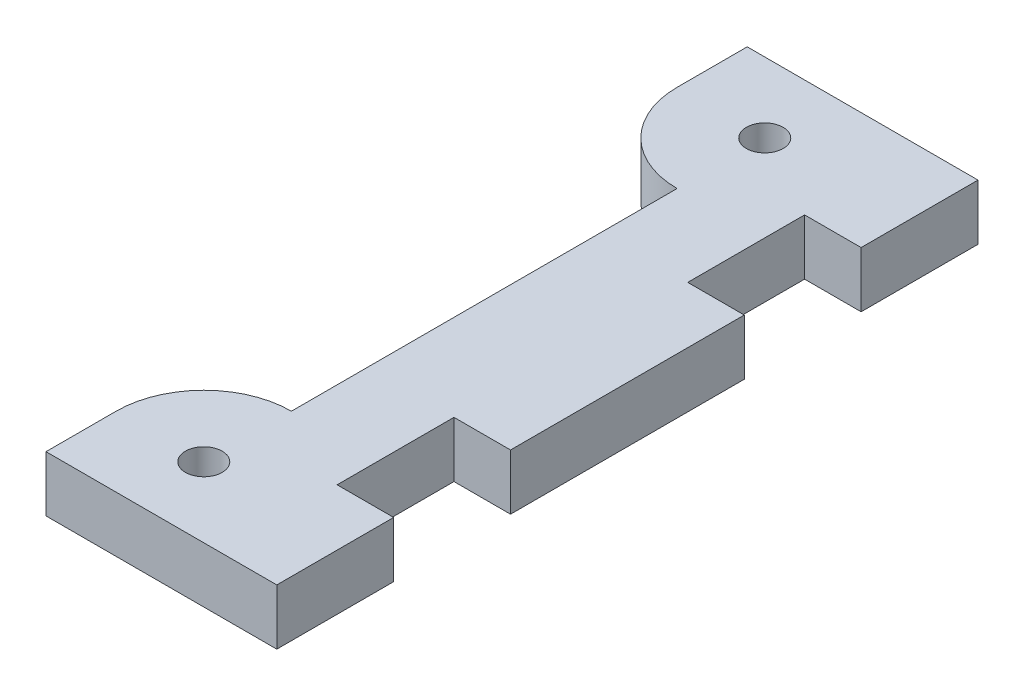
ISO-10303-21;
HEADER;
FILE_DESCRIPTION(('STEP AP214'),'2;1');
FILE_NAME('part.step','',(''),(''),'','','');
FILE_SCHEMA(('AUTOMOTIVE_DESIGN { 1 0 10303 214 1 1 1 1 }'));
ENDSEC;
DATA;
#1=APPLICATION_CONTEXT('core data for automotive mechanical design processes');
#2=APPLICATION_PROTOCOL_DEFINITION('international standard','automotive_design',2000,#1);
#3=PRODUCT_CONTEXT('',#1,'mechanical');
#4=PRODUCT('Part','Part','',(#3));
#5=PRODUCT_RELATED_PRODUCT_CATEGORY('part','',(#4));
#6=PRODUCT_DEFINITION_FORMATION('','',#4);
#7=PRODUCT_DEFINITION_CONTEXT('part definition',#1,'design');
#8=PRODUCT_DEFINITION('design','',#6,#7);
#9=PRODUCT_DEFINITION_SHAPE('','',#8);
#10=(LENGTH_UNIT() NAMED_UNIT(*) SI_UNIT(.MILLI.,.METRE.));
#11=(NAMED_UNIT(*) PLANE_ANGLE_UNIT() SI_UNIT($,.RADIAN.));
#12=(NAMED_UNIT(*) SI_UNIT($,.STERADIAN.) SOLID_ANGLE_UNIT());
#13=UNCERTAINTY_MEASURE_WITH_UNIT(LENGTH_MEASURE(1.E-05),#10,'distance_accuracy_value','');
#14=(GEOMETRIC_REPRESENTATION_CONTEXT(3) GLOBAL_UNCERTAINTY_ASSIGNED_CONTEXT((#13)) GLOBAL_UNIT_ASSIGNED_CONTEXT((#10,
#11,#12)) REPRESENTATION_CONTEXT('',''));
#15=CARTESIAN_POINT('',(0.,0.,0.));
#16=DIRECTION('',(0.,0.,1.));
#17=DIRECTION('',(1.,0.,0.));
#18=AXIS2_PLACEMENT_3D('',#15,#16,#17);
#19=CARTESIAN_POINT('',(44.165,6.35,40.));
#20=DIRECTION('',(-1.,0.,0.));
#21=DIRECTION('',(0.,0.,1.));
#22=AXIS2_PLACEMENT_3D('',#19,#20,#21);
#23=PLANE('',#22);
#24=DIRECTION('',(0.,0.,-1.));
#25=VECTOR('',#24,1.);
#26=CARTESIAN_POINT('',(44.165,0.,40.));
#27=LINE('',#26,#25);
#28=CARTESIAN_POINT('',(44.165,0.,40.));
#29=VERTEX_POINT('',#28);
#30=CARTESIAN_POINT('',(44.165,0.,26.6666666666667));
#31=VERTEX_POINT('',#30);
#32=EDGE_CURVE('E274',#29,#31,#27,.T.);
#33=ORIENTED_EDGE('',*,*,#32,.T.);
#34=DIRECTION('',(0.,1.,0.));
#35=VECTOR('',#34,1.);
#36=CARTESIAN_POINT('',(44.165,0.,26.6666666666667));
#37=LINE('',#36,#35);
#38=CARTESIAN_POINT('',(44.165,6.35,26.6666666666667));
#39=VERTEX_POINT('',#38);
#40=EDGE_CURVE('E232',#31,#39,#37,.T.);
#41=ORIENTED_EDGE('',*,*,#40,.T.);
#42=DIRECTION('',(0.,0.,-1.));
#43=VECTOR('',#42,1.);
#44=CARTESIAN_POINT('',(44.165,6.35,40.));
#45=LINE('',#44,#43);
#46=CARTESIAN_POINT('',(44.165,6.35,40.));
#47=VERTEX_POINT('',#46);
#48=EDGE_CURVE('E265',#47,#39,#45,.T.);
#49=ORIENTED_EDGE('',*,*,#48,.F.);
#50=DIRECTION('',(0.,-1.,0.));
#51=VECTOR('',#50,1.);
#52=CARTESIAN_POINT('',(44.165,6.35,40.));
#53=LINE('',#52,#51);
#54=EDGE_CURVE('E273',#47,#29,#53,.T.);
#55=ORIENTED_EDGE('',*,*,#54,.T.);
#56=EDGE_LOOP('',(#33,#41,#49,#55));
#57=FACE_BOUND('',#56,.T.);
#58=ADVANCED_FACE('F51',(#57),#23,.F.);
#59=CARTESIAN_POINT('',(44.165,6.35,13.3333333333333));
#60=VERTEX_POINT('',#59);
#61=CARTESIAN_POINT('',(44.165,6.35,-13.3333333333333));
#62=VERTEX_POINT('',#61);
#63=EDGE_CURVE('E268',#60,#62,#45,.T.);
#64=ORIENTED_EDGE('',*,*,#63,.F.);
#65=DIRECTION('',(0.,1.,0.));
#66=VECTOR('',#65,1.);
#67=CARTESIAN_POINT('',(44.165,0.,13.3333333333333));
#68=LINE('',#67,#66);
#69=CARTESIAN_POINT('',(44.165,0.,13.3333333333333));
#70=VERTEX_POINT('',#69);
#71=EDGE_CURVE('E223',#70,#60,#68,.T.);
#72=ORIENTED_EDGE('',*,*,#71,.F.);
#73=CARTESIAN_POINT('',(44.165,0.,-13.3333333333333));
#74=VERTEX_POINT('',#73);
#75=EDGE_CURVE('E278',#70,#74,#27,.T.);
#76=ORIENTED_EDGE('',*,*,#75,.T.);
#77=DIRECTION('',(0.,1.,0.));
#78=VECTOR('',#77,1.);
#79=CARTESIAN_POINT('',(44.165,0.,-13.3333333333333));
#80=LINE('',#79,#78);
#81=EDGE_CURVE('E214',#74,#62,#80,.T.);
#82=ORIENTED_EDGE('',*,*,#81,.T.);
#83=EDGE_LOOP('',(#64,#72,#76,#82));
#84=FACE_BOUND('',#83,.T.);
#85=ADVANCED_FACE('F325',(#84),#23,.F.);
#86=CARTESIAN_POINT('',(44.165,6.35,-26.6666666666667));
#87=VERTEX_POINT('',#86);
#88=CARTESIAN_POINT('',(44.165,6.35,-40.));
#89=VERTEX_POINT('',#88);
#90=EDGE_CURVE('E269',#87,#89,#45,.T.);
#91=ORIENTED_EDGE('',*,*,#90,.F.);
#92=DIRECTION('',(0.,1.,0.));
#93=VECTOR('',#92,1.);
#94=CARTESIAN_POINT('',(44.165,0.,-26.6666666666667));
#95=LINE('',#94,#93);
#96=CARTESIAN_POINT('',(44.165,0.,-26.6666666666667));
#97=VERTEX_POINT('',#96);
#98=EDGE_CURVE('E241',#97,#87,#95,.T.);
#99=ORIENTED_EDGE('',*,*,#98,.F.);
#100=CARTESIAN_POINT('',(44.165,0.,-40.));
#101=VERTEX_POINT('',#100);
#102=EDGE_CURVE('E235',#97,#101,#27,.T.);
#103=ORIENTED_EDGE('',*,*,#102,.T.);
#104=DIRECTION('',(0.,-1.,0.));
#105=VECTOR('',#104,1.);
#106=CARTESIAN_POINT('',(44.165,6.35,-40.));
#107=LINE('',#106,#105);
#108=EDGE_CURVE('E285',#89,#101,#107,.T.);
#109=ORIENTED_EDGE('',*,*,#108,.F.);
#110=EDGE_LOOP('',(#91,#99,#103,#109));
#111=FACE_BOUND('',#110,.T.);
#112=ADVANCED_FACE('F53',(#111),#23,.F.);
#113=CARTESIAN_POINT('',(-44.165,6.35,-40.));
#114=DIRECTION('',(0.,0.,1.));
#115=DIRECTION('',(1.,0.,0.));
#116=AXIS2_PLACEMENT_3D('',#113,#114,#115);
#117=PLANE('',#116);
#118=DIRECTION('',(-1.,0.,0.));
#119=VECTOR('',#118,1.);
#120=CARTESIAN_POINT('',(-44.165,0.,-40.));
#121=LINE('',#120,#119);
#122=CARTESIAN_POINT('',(17.8350000000002,0.,-40.));
#123=VERTEX_POINT('',#122);
#124=EDGE_CURVE('E277',#101,#123,#121,.T.);
#125=ORIENTED_EDGE('',*,*,#124,.T.);
#126=DIRECTION('',(0.,-1.,0.));
#127=VECTOR('',#126,1.);
#128=CARTESIAN_POINT('',(17.8350000000002,-0.00100000000000013,-40.));
#129=LINE('',#128,#127);
#130=CARTESIAN_POINT('',(17.8350000000002,6.35,-40.));
#131=VERTEX_POINT('',#130);
#132=EDGE_CURVE('E336',#131,#123,#129,.T.);
#133=ORIENTED_EDGE('',*,*,#132,.F.);
#134=DIRECTION('',(-1.,0.,0.));
#135=VECTOR('',#134,1.);
#136=CARTESIAN_POINT('',(-44.165,6.35,-40.));
#137=LINE('',#136,#135);
#138=EDGE_CURVE('E185',#89,#131,#137,.T.);
#139=ORIENTED_EDGE('',*,*,#138,.F.);
#140=ORIENTED_EDGE('',*,*,#108,.T.);
#141=EDGE_LOOP('',(#125,#133,#139,#140));
#142=FACE_BOUND('',#141,.T.);
#143=ADVANCED_FACE('F335',(#142),#117,.F.);
#144=CARTESIAN_POINT('',(-44.165,6.35,40.));
#145=DIRECTION('',(0.,0.,-1.));
#146=DIRECTION('',(-1.,0.,0.));
#147=AXIS2_PLACEMENT_3D('',#144,#145,#146);
#148=PLANE('',#147);
#149=DIRECTION('',(1.,0.,0.));
#150=VECTOR('',#149,1.);
#151=CARTESIAN_POINT('',(-44.165,6.35,40.));
#152=LINE('',#151,#150);
#153=CARTESIAN_POINT('',(17.8349999999997,6.35,40.));
#154=VERTEX_POINT('',#153);
#155=EDGE_CURVE('E271',#154,#47,#152,.T.);
#156=ORIENTED_EDGE('',*,*,#155,.F.);
#157=DIRECTION('',(0.,1.,0.));
#158=VECTOR('',#157,1.);
#159=CARTESIAN_POINT('',(17.8349999999997,-0.00100000000000013,40.));
#160=LINE('',#159,#158);
#161=CARTESIAN_POINT('',(17.8349999999997,0.,40.));
#162=VERTEX_POINT('',#161);
#163=EDGE_CURVE('E307',#162,#154,#160,.T.);
#164=ORIENTED_EDGE('',*,*,#163,.F.);
#165=DIRECTION('',(1.,0.,0.));
#166=VECTOR('',#165,1.);
#167=CARTESIAN_POINT('',(-44.165,0.,40.));
#168=LINE('',#167,#166);
#169=EDGE_CURVE('E281',#162,#29,#168,.T.);
#170=ORIENTED_EDGE('',*,*,#169,.T.);
#171=ORIENTED_EDGE('',*,*,#54,.F.);
#172=EDGE_LOOP('',(#156,#164,#170,#171));
#173=FACE_BOUND('',#172,.T.);
#174=ADVANCED_FACE('F306',(#173),#148,.F.);
#175=CARTESIAN_POINT('',(0.,6.35,0.));
#176=DIRECTION('',(0.,-1.,0.));
#177=DIRECTION('',(0.,0.,-1.));
#178=AXIS2_PLACEMENT_3D('',#175,#176,#177);
#179=PLANE('',#178);
#180=ORIENTED_EDGE('',*,*,#138,.T.);
#181=DIRECTION('',(0.,0.,-1.));
#182=VECTOR('',#181,1.);
#183=CARTESIAN_POINT('',(17.8350000000002,6.35,-45.));
#184=LINE('',#183,#182);
#185=CARTESIAN_POINT('',(17.8350000000002,6.35,-31.9999999999998));
#186=VERTEX_POINT('',#185);
#187=EDGE_CURVE('E168',#186,#131,#184,.T.);
#188=ORIENTED_EDGE('',*,*,#187,.F.);
#189=CARTESIAN_POINT('',(27.8350000000002,6.35,-31.9999999999998));
#190=DIRECTION('',(0.,-1.,0.));
#191=DIRECTION('',(0.,0.,1.));
#192=AXIS2_PLACEMENT_3D('',#189,#190,#191);
#193=CIRCLE('',#192,10.);
#194=CARTESIAN_POINT('',(27.8350000000002,6.35,-21.9999999999998));
#195=VERTEX_POINT('',#194);
#196=EDGE_CURVE('E175',#195,#186,#193,.T.);
#197=ORIENTED_EDGE('',*,*,#196,.F.);
#198=DIRECTION('',(0.,0.,-1.));
#199=VECTOR('',#198,1.);
#200=CARTESIAN_POINT('',(27.8349999999999,6.35,10.0000000000003));
#201=LINE('',#200,#199);
#202=CARTESIAN_POINT('',(27.8349999999998,6.35,22.0000000000003));
#203=VERTEX_POINT('',#202);
#204=EDGE_CURVE('E201',#203,#195,#201,.T.);
#205=ORIENTED_EDGE('',*,*,#204,.F.);
#206=CARTESIAN_POINT('',(27.8349999999997,6.35,32.0000000000003));
#207=DIRECTION('',(0.,-1.,0.));
#208=DIRECTION('',(0.,0.,1.));
#209=AXIS2_PLACEMENT_3D('',#206,#207,#208);
#210=CIRCLE('',#209,10.);
#211=CARTESIAN_POINT('',(17.8349999999997,6.35,32.0000000000002));
#212=VERTEX_POINT('',#211);
#213=EDGE_CURVE('E66',#212,#203,#210,.T.);
#214=ORIENTED_EDGE('',*,*,#213,.F.);
#215=DIRECTION('',(0.,0.,-1.));
#216=VECTOR('',#215,1.);
#217=CARTESIAN_POINT('',(17.8349999999997,6.35,32.0000000000002));
#218=LINE('',#217,#216);
#219=EDGE_CURVE('E187',#154,#212,#218,.T.);
#220=ORIENTED_EDGE('',*,*,#219,.F.);
#221=ORIENTED_EDGE('',*,*,#155,.T.);
#222=ORIENTED_EDGE('',*,*,#48,.T.);
#223=DIRECTION('',(1.,0.,0.));
#224=VECTOR('',#223,1.);
#225=CARTESIAN_POINT('',(44.165,6.35,26.6666666666667));
#226=LINE('',#225,#224);
#227=CARTESIAN_POINT('',(37.715,6.35,26.6666666666667));
#228=VERTEX_POINT('',#227);
#229=EDGE_CURVE('E218',#228,#39,#226,.T.);
#230=ORIENTED_EDGE('',*,*,#229,.F.);
#231=DIRECTION('',(0.,0.,1.));
#232=VECTOR('',#231,1.);
#233=CARTESIAN_POINT('',(37.715,6.35,26.6666666666667));
#234=LINE('',#233,#232);
#235=CARTESIAN_POINT('',(37.715,6.35,13.3333333333333));
#236=VERTEX_POINT('',#235);
#237=EDGE_CURVE('E227',#236,#228,#234,.T.);
#238=ORIENTED_EDGE('',*,*,#237,.F.);
#239=DIRECTION('',(-1.,0.,0.));
#240=VECTOR('',#239,1.);
#241=CARTESIAN_POINT('',(37.715,6.35,13.3333333333333));
#242=LINE('',#241,#240);
#243=EDGE_CURVE('E224',#60,#236,#242,.T.);
#244=ORIENTED_EDGE('',*,*,#243,.F.);
#245=ORIENTED_EDGE('',*,*,#63,.T.);
#246=DIRECTION('',(1.,0.,0.));
#247=VECTOR('',#246,1.);
#248=CARTESIAN_POINT('',(37.715,6.35,-13.3333333333333));
#249=LINE('',#248,#247);
#250=CARTESIAN_POINT('',(37.715,6.35,-13.3333333333333));
#251=VERTEX_POINT('',#250);
#252=EDGE_CURVE('E250',#251,#62,#249,.T.);
#253=ORIENTED_EDGE('',*,*,#252,.F.);
#254=DIRECTION('',(0.,0.,1.));
#255=VECTOR('',#254,1.);
#256=CARTESIAN_POINT('',(37.715,6.35,-26.6666666666667));
#257=LINE('',#256,#255);
#258=CARTESIAN_POINT('',(37.715,6.35,-26.6666666666667));
#259=VERTEX_POINT('',#258);
#260=EDGE_CURVE('E252',#259,#251,#257,.T.);
#261=ORIENTED_EDGE('',*,*,#260,.F.);
#262=DIRECTION('',(-1.,0.,0.));
#263=VECTOR('',#262,1.);
#264=CARTESIAN_POINT('',(44.165,6.35,-26.6666666666667));
#265=LINE('',#264,#263);
#266=EDGE_CURVE('E228',#87,#259,#265,.T.);
#267=ORIENTED_EDGE('',*,*,#266,.F.);
#268=ORIENTED_EDGE('',*,*,#90,.T.);
#269=EDGE_LOOP('',(#180,#188,#197,#205,#214,#220,#221,#222,#230,#238,#244,#245,#253,#261,#267,#268));
#270=FACE_BOUND('',#269,.T.);
#271=CARTESIAN_POINT('',(27.835,6.35,-32.));
#272=DIRECTION('',(0.,1.,0.));
#273=DIRECTION('',(0.,0.,1.));
#274=AXIS2_PLACEMENT_3D('',#271,#272,#273);
#275=CIRCLE('',#274,2.09999999999998);
#276=CARTESIAN_POINT('',(27.835,6.35,-29.9));
#277=VERTEX_POINT('',#276);
#278=EDGE_CURVE('E192',#277,#277,#275,.T.);
#279=ORIENTED_EDGE('',*,*,#278,.F.);
#280=EDGE_LOOP('',(#279));
#281=FACE_BOUND('',#280,.T.);
#282=CARTESIAN_POINT('',(27.835,6.35,32.));
#283=DIRECTION('',(0.,1.,0.));
#284=DIRECTION('',(0.,0.,1.));
#285=AXIS2_PLACEMENT_3D('',#282,#283,#284);
#286=CIRCLE('',#285,2.09999999999998);
#287=CARTESIAN_POINT('',(27.835,6.35,34.1));
#288=VERTEX_POINT('',#287);
#289=EDGE_CURVE('E208',#288,#288,#286,.T.);
#290=ORIENTED_EDGE('',*,*,#289,.F.);
#291=EDGE_LOOP('',(#290));
#292=FACE_BOUND('',#291,.T.);
#293=ADVANCED_FACE('F181',(#270,#281,#292),#179,.F.);
#294=CARTESIAN_POINT('',(0.,0.,0.));
#295=DIRECTION('',(0.,-1.,0.));
#296=DIRECTION('',(0.,0.,-1.));
#297=AXIS2_PLACEMENT_3D('',#294,#295,#296);
#298=PLANE('',#297);
#299=DIRECTION('',(0.,0.,-1.));
#300=VECTOR('',#299,1.);
#301=CARTESIAN_POINT('',(17.8350000000002,0.,-45.));
#302=LINE('',#301,#300);
#303=CARTESIAN_POINT('',(17.8350000000002,0.,-31.9999999999998));
#304=VERTEX_POINT('',#303);
#305=EDGE_CURVE('E171',#304,#123,#302,.T.);
#306=ORIENTED_EDGE('',*,*,#305,.T.);
#307=ORIENTED_EDGE('',*,*,#124,.F.);
#308=ORIENTED_EDGE('',*,*,#102,.F.);
#309=DIRECTION('',(-1.,0.,0.));
#310=VECTOR('',#309,1.);
#311=CARTESIAN_POINT('',(44.165,0.,-26.6666666666667));
#312=LINE('',#311,#310);
#313=CARTESIAN_POINT('',(37.715,0.,-26.6666666666667));
#314=VERTEX_POINT('',#313);
#315=EDGE_CURVE('E253',#97,#314,#312,.T.);
#316=ORIENTED_EDGE('',*,*,#315,.T.);
#317=DIRECTION('',(0.,0.,1.));
#318=VECTOR('',#317,1.);
#319=CARTESIAN_POINT('',(37.715,0.,-26.6666666666667));
#320=LINE('',#319,#318);
#321=CARTESIAN_POINT('',(37.715,0.,-13.3333333333333));
#322=VERTEX_POINT('',#321);
#323=EDGE_CURVE('E260',#314,#322,#320,.T.);
#324=ORIENTED_EDGE('',*,*,#323,.T.);
#325=DIRECTION('',(1.,0.,0.));
#326=VECTOR('',#325,1.);
#327=CARTESIAN_POINT('',(37.715,0.,-13.3333333333333));
#328=LINE('',#327,#326);
#329=EDGE_CURVE('E243',#322,#74,#328,.T.);
#330=ORIENTED_EDGE('',*,*,#329,.T.);
#331=ORIENTED_EDGE('',*,*,#75,.F.);
#332=DIRECTION('',(-1.,0.,0.));
#333=VECTOR('',#332,1.);
#334=CARTESIAN_POINT('',(37.715,0.,13.3333333333333));
#335=LINE('',#334,#333);
#336=CARTESIAN_POINT('',(37.715,0.,13.3333333333333));
#337=VERTEX_POINT('',#336);
#338=EDGE_CURVE('E215',#70,#337,#335,.T.);
#339=ORIENTED_EDGE('',*,*,#338,.T.);
#340=DIRECTION('',(0.,0.,1.));
#341=VECTOR('',#340,1.);
#342=CARTESIAN_POINT('',(37.715,0.,26.6666666666667));
#343=LINE('',#342,#341);
#344=CARTESIAN_POINT('',(37.715,0.,26.6666666666667));
#345=VERTEX_POINT('',#344);
#346=EDGE_CURVE('E74',#337,#345,#343,.T.);
#347=ORIENTED_EDGE('',*,*,#346,.T.);
#348=DIRECTION('',(1.,0.,0.));
#349=VECTOR('',#348,1.);
#350=CARTESIAN_POINT('',(44.165,0.,26.6666666666667));
#351=LINE('',#350,#349);
#352=EDGE_CURVE('E220',#345,#31,#351,.T.);
#353=ORIENTED_EDGE('',*,*,#352,.T.);
#354=ORIENTED_EDGE('',*,*,#32,.F.);
#355=ORIENTED_EDGE('',*,*,#169,.F.);
#356=DIRECTION('',(0.,0.,-1.));
#357=VECTOR('',#356,1.);
#358=CARTESIAN_POINT('',(17.8349999999997,0.,32.0000000000002));
#359=LINE('',#358,#357);
#360=CARTESIAN_POINT('',(17.8349999999997,0.,32.0000000000002));
#361=VERTEX_POINT('',#360);
#362=EDGE_CURVE('E186',#162,#361,#359,.T.);
#363=ORIENTED_EDGE('',*,*,#362,.T.);
#364=CARTESIAN_POINT('',(27.8349999999997,0.,32.0000000000003));
#365=DIRECTION('',(0.,-1.,0.));
#366=DIRECTION('',(0.,0.,-1.));
#367=AXIS2_PLACEMENT_3D('',#364,#365,#366);
#368=CIRCLE('',#367,10.);
#369=CARTESIAN_POINT('',(27.8349999999998,0.,22.0000000000003));
#370=VERTEX_POINT('',#369);
#371=EDGE_CURVE('E11',#370,#361,#368,.F.);
#372=ORIENTED_EDGE('',*,*,#371,.F.);
#373=DIRECTION('',(0.,0.,1.));
#374=VECTOR('',#373,1.);
#375=CARTESIAN_POINT('',(27.835,0.,1.77048769163986E-13));
#376=LINE('',#375,#374);
#377=CARTESIAN_POINT('',(27.8350000000002,0.,-21.9999999999998));
#378=VERTEX_POINT('',#377);
#379=EDGE_CURVE('E288',#378,#370,#376,.T.);
#380=ORIENTED_EDGE('',*,*,#379,.F.);
#381=CARTESIAN_POINT('',(27.8350000000002,0.,-31.9999999999998));
#382=DIRECTION('',(0.,-1.,0.));
#383=DIRECTION('',(0.,0.,-1.));
#384=AXIS2_PLACEMENT_3D('',#381,#382,#383);
#385=CIRCLE('',#384,10.);
#386=EDGE_CURVE('E59',#304,#378,#385,.F.);
#387=ORIENTED_EDGE('',*,*,#386,.F.);
#388=EDGE_LOOP('',(#306,#307,#308,#316,#324,#330,#331,#339,#347,#353,#354,#355,#363,#372,#380,#387));
#389=FACE_BOUND('',#388,.T.);
#390=CARTESIAN_POINT('',(27.835,0.,-32.));
#391=DIRECTION('',(0.,1.,0.));
#392=DIRECTION('',(0.,0.,1.));
#393=AXIS2_PLACEMENT_3D('',#390,#391,#392);
#394=CIRCLE('',#393,2.09999999999998);
#395=CARTESIAN_POINT('',(27.835,0.,-29.9));
#396=VERTEX_POINT('',#395);
#397=EDGE_CURVE('E195',#396,#396,#394,.T.);
#398=ORIENTED_EDGE('',*,*,#397,.T.);
#399=EDGE_LOOP('',(#398));
#400=FACE_BOUND('',#399,.T.);
#401=CARTESIAN_POINT('',(27.835,0.,32.));
#402=DIRECTION('',(0.,1.,0.));
#403=DIRECTION('',(0.,0.,1.));
#404=AXIS2_PLACEMENT_3D('',#401,#402,#403);
#405=CIRCLE('',#404,2.09999999999998);
#406=CARTESIAN_POINT('',(27.835,0.,34.1));
#407=VERTEX_POINT('',#406);
#408=EDGE_CURVE('E211',#407,#407,#405,.T.);
#409=ORIENTED_EDGE('',*,*,#408,.T.);
#410=EDGE_LOOP('',(#409));
#411=FACE_BOUND('',#410,.T.);
#412=ADVANCED_FACE('F294',(#389,#400,#411),#298,.T.);
#413=CARTESIAN_POINT('',(37.715,0.,-13.3333333333333));
#414=DIRECTION('',(0.,0.,1.));
#415=DIRECTION('',(1.,0.,0.));
#416=AXIS2_PLACEMENT_3D('',#413,#414,#415);
#417=PLANE('',#416);
#418=ORIENTED_EDGE('',*,*,#252,.T.);
#419=ORIENTED_EDGE('',*,*,#81,.F.);
#420=ORIENTED_EDGE('',*,*,#329,.F.);
#421=DIRECTION('',(0.,1.,0.));
#422=VECTOR('',#421,1.);
#423=CARTESIAN_POINT('',(37.715,0.,-13.3333333333333));
#424=LINE('',#423,#422);
#425=EDGE_CURVE('E246',#322,#251,#424,.T.);
#426=ORIENTED_EDGE('',*,*,#425,.T.);
#427=EDGE_LOOP('',(#418,#419,#420,#426));
#428=FACE_BOUND('',#427,.T.);
#429=ADVANCED_FACE('F370',(#428),#417,.F.);
#430=CARTESIAN_POINT('',(37.715,0.,-26.6666666666667));
#431=DIRECTION('',(-1.,0.,0.));
#432=DIRECTION('',(0.,0.,1.));
#433=AXIS2_PLACEMENT_3D('',#430,#431,#432);
#434=PLANE('',#433);
#435=ORIENTED_EDGE('',*,*,#260,.T.);
#436=ORIENTED_EDGE('',*,*,#425,.F.);
#437=ORIENTED_EDGE('',*,*,#323,.F.);
#438=DIRECTION('',(0.,1.,0.));
#439=VECTOR('',#438,1.);
#440=CARTESIAN_POINT('',(37.715,0.,-26.6666666666667));
#441=LINE('',#440,#439);
#442=EDGE_CURVE('E244',#314,#259,#441,.T.);
#443=ORIENTED_EDGE('',*,*,#442,.T.);
#444=EDGE_LOOP('',(#435,#436,#437,#443));
#445=FACE_BOUND('',#444,.T.);
#446=ADVANCED_FACE('F374',(#445),#434,.F.);
#447=CARTESIAN_POINT('',(44.165,0.,-26.6666666666667));
#448=DIRECTION('',(0.,0.,-1.));
#449=DIRECTION('',(-1.,0.,0.));
#450=AXIS2_PLACEMENT_3D('',#447,#448,#449);
#451=PLANE('',#450);
#452=ORIENTED_EDGE('',*,*,#266,.T.);
#453=ORIENTED_EDGE('',*,*,#442,.F.);
#454=ORIENTED_EDGE('',*,*,#315,.F.);
#455=ORIENTED_EDGE('',*,*,#98,.T.);
#456=EDGE_LOOP('',(#452,#453,#454,#455));
#457=FACE_BOUND('',#456,.T.);
#458=ADVANCED_FACE('F378',(#457),#451,.F.);
#459=CARTESIAN_POINT('',(44.165,0.,26.6666666666667));
#460=DIRECTION('',(0.,0.,1.));
#461=DIRECTION('',(1.,0.,0.));
#462=AXIS2_PLACEMENT_3D('',#459,#460,#461);
#463=PLANE('',#462);
#464=ORIENTED_EDGE('',*,*,#229,.T.);
#465=ORIENTED_EDGE('',*,*,#40,.F.);
#466=ORIENTED_EDGE('',*,*,#352,.F.);
#467=DIRECTION('',(0.,1.,0.));
#468=VECTOR('',#467,1.);
#469=CARTESIAN_POINT('',(37.715,0.,26.6666666666667));
#470=LINE('',#469,#468);
#471=EDGE_CURVE('E236',#345,#228,#470,.T.);
#472=ORIENTED_EDGE('',*,*,#471,.T.);
#473=EDGE_LOOP('',(#464,#465,#466,#472));
#474=FACE_BOUND('',#473,.T.);
#475=ADVANCED_FACE('F315',(#474),#463,.F.);
#476=CARTESIAN_POINT('',(37.715,0.,26.6666666666667));
#477=DIRECTION('',(-1.,0.,0.));
#478=DIRECTION('',(0.,0.,1.));
#479=AXIS2_PLACEMENT_3D('',#476,#477,#478);
#480=PLANE('',#479);
#481=ORIENTED_EDGE('',*,*,#237,.T.);
#482=ORIENTED_EDGE('',*,*,#471,.F.);
#483=ORIENTED_EDGE('',*,*,#346,.F.);
#484=DIRECTION('',(0.,1.,0.));
#485=VECTOR('',#484,1.);
#486=CARTESIAN_POINT('',(37.715,0.,13.3333333333333));
#487=LINE('',#486,#485);
#488=EDGE_CURVE('E238',#337,#236,#487,.T.);
#489=ORIENTED_EDGE('',*,*,#488,.T.);
#490=EDGE_LOOP('',(#481,#482,#483,#489));
#491=FACE_BOUND('',#490,.T.);
#492=ADVANCED_FACE('F317',(#491),#480,.F.);
#493=CARTESIAN_POINT('',(37.715,0.,13.3333333333333));
#494=DIRECTION('',(0.,0.,-1.));
#495=DIRECTION('',(-1.,0.,0.));
#496=AXIS2_PLACEMENT_3D('',#493,#494,#495);
#497=PLANE('',#496);
#498=ORIENTED_EDGE('',*,*,#243,.T.);
#499=ORIENTED_EDGE('',*,*,#488,.F.);
#500=ORIENTED_EDGE('',*,*,#338,.F.);
#501=ORIENTED_EDGE('',*,*,#71,.T.);
#502=EDGE_LOOP('',(#498,#499,#500,#501));
#503=FACE_BOUND('',#502,.T.);
#504=ADVANCED_FACE('F319',(#503),#497,.F.);
#505=CARTESIAN_POINT('',(27.835,6.35,32.));
#506=DIRECTION('',(0.,1.,0.));
#507=DIRECTION('',(0.,0.,1.));
#508=AXIS2_PLACEMENT_3D('',#505,#506,#507);
#509=CYLINDRICAL_SURFACE('',#508,2.09999999999998);
#510=ORIENTED_EDGE('',*,*,#408,.F.);
#511=EDGE_LOOP('',(#510));
#512=FACE_BOUND('',#511,.T.);
#513=ORIENTED_EDGE('',*,*,#289,.T.);
#514=EDGE_LOOP('',(#513));
#515=FACE_BOUND('',#514,.T.);
#516=ADVANCED_FACE('F385',(#512,#515),#509,.F.);
#517=CARTESIAN_POINT('',(27.835,6.35,-32.));
#518=DIRECTION('',(0.,1.,0.));
#519=DIRECTION('',(0.,0.,1.));
#520=AXIS2_PLACEMENT_3D('',#517,#518,#519);
#521=CYLINDRICAL_SURFACE('',#520,2.09999999999998);
#522=ORIENTED_EDGE('',*,*,#397,.F.);
#523=EDGE_LOOP('',(#522));
#524=FACE_BOUND('',#523,.T.);
#525=ORIENTED_EDGE('',*,*,#278,.T.);
#526=EDGE_LOOP('',(#525));
#527=FACE_BOUND('',#526,.T.);
#528=ADVANCED_FACE('F392',(#524,#527),#521,.F.);
#529=CARTESIAN_POINT('',(27.8350000000002,-3.65,-31.9999999999998));
#530=DIRECTION('',(0.,1.,0.));
#531=DIRECTION('',(0.,0.,1.));
#532=AXIS2_PLACEMENT_3D('',#529,#530,#531);
#533=CYLINDRICAL_SURFACE('',#532,10.);
#534=ORIENTED_EDGE('',*,*,#386,.T.);
#535=DIRECTION('',(0.,1.,0.));
#536=VECTOR('',#535,1.);
#537=CARTESIAN_POINT('',(27.8350000000002,-3.65,-21.9999999999998));
#538=LINE('',#537,#536);
#539=EDGE_CURVE('E176',#378,#195,#538,.T.);
#540=ORIENTED_EDGE('',*,*,#539,.T.);
#541=ORIENTED_EDGE('',*,*,#196,.T.);
#542=DIRECTION('',(0.,1.,0.));
#543=VECTOR('',#542,1.);
#544=CARTESIAN_POINT('',(17.8350000000002,-3.65,-31.9999999999998));
#545=LINE('',#544,#543);
#546=EDGE_CURVE('E165',#304,#186,#545,.T.);
#547=ORIENTED_EDGE('',*,*,#546,.F.);
#548=EDGE_LOOP('',(#534,#540,#541,#547));
#549=FACE_BOUND('',#548,.T.);
#550=ADVANCED_FACE('F190',(#549),#533,.T.);
#551=CARTESIAN_POINT('',(27.8349999999997,-3.65,32.0000000000003));
#552=DIRECTION('',(0.,1.,0.));
#553=DIRECTION('',(0.,0.,1.));
#554=AXIS2_PLACEMENT_3D('',#551,#552,#553);
#555=CYLINDRICAL_SURFACE('',#554,10.);
#556=ORIENTED_EDGE('',*,*,#371,.T.);
#557=DIRECTION('',(0.,1.,0.));
#558=VECTOR('',#557,1.);
#559=CARTESIAN_POINT('',(17.8349999999997,-3.65,32.0000000000002));
#560=LINE('',#559,#558);
#561=EDGE_CURVE('E202',#361,#212,#560,.T.);
#562=ORIENTED_EDGE('',*,*,#561,.T.);
#563=ORIENTED_EDGE('',*,*,#213,.T.);
#564=DIRECTION('',(0.,1.,0.));
#565=VECTOR('',#564,1.);
#566=CARTESIAN_POINT('',(27.8349999999998,-3.65,22.0000000000003));
#567=LINE('',#566,#565);
#568=EDGE_CURVE('E199',#370,#203,#567,.T.);
#569=ORIENTED_EDGE('',*,*,#568,.F.);
#570=EDGE_LOOP('',(#556,#562,#563,#569));
#571=FACE_BOUND('',#570,.T.);
#572=ADVANCED_FACE('F298',(#571),#555,.T.);
#573=CARTESIAN_POINT('',(27.8349999999999,-3.65,10.0000000000003));
#574=DIRECTION('',(1.,0.,0.));
#575=DIRECTION('',(0.,0.,-1.));
#576=AXIS2_PLACEMENT_3D('',#573,#574,#575);
#577=PLANE('',#576);
#578=ORIENTED_EDGE('',*,*,#379,.T.);
#579=ORIENTED_EDGE('',*,*,#568,.T.);
#580=ORIENTED_EDGE('',*,*,#204,.T.);
#581=ORIENTED_EDGE('',*,*,#539,.F.);
#582=EDGE_LOOP('',(#578,#579,#580,#581));
#583=FACE_BOUND('',#582,.T.);
#584=ADVANCED_FACE('F292',(#583),#577,.F.);
#585=CARTESIAN_POINT('',(17.8349999999997,-0.00100000000000013,32.0000000000002));
#586=DIRECTION('',(1.,0.,0.));
#587=DIRECTION('',(0.,0.,-1.));
#588=AXIS2_PLACEMENT_3D('',#585,#586,#587);
#589=PLANE('',#588);
#590=ORIENTED_EDGE('',*,*,#163,.T.);
#591=ORIENTED_EDGE('',*,*,#219,.T.);
#592=ORIENTED_EDGE('',*,*,#561,.F.);
#593=ORIENTED_EDGE('',*,*,#362,.F.);
#594=EDGE_LOOP('',(#590,#591,#592,#593));
#595=FACE_BOUND('',#594,.T.);
#596=ADVANCED_FACE('F343',(#595),#589,.F.);
#597=CARTESIAN_POINT('',(17.8350000000002,-0.00100000000000013,-45.));
#598=DIRECTION('',(1.,0.,0.));
#599=DIRECTION('',(0.,0.,-1.));
#600=AXIS2_PLACEMENT_3D('',#597,#598,#599);
#601=PLANE('',#600);
#602=ORIENTED_EDGE('',*,*,#132,.T.);
#603=ORIENTED_EDGE('',*,*,#305,.F.);
#604=ORIENTED_EDGE('',*,*,#546,.T.);
#605=ORIENTED_EDGE('',*,*,#187,.T.);
#606=EDGE_LOOP('',(#602,#603,#604,#605));
#607=FACE_BOUND('',#606,.T.);
#608=ADVANCED_FACE('F167',(#607),#601,.F.);
#609=CLOSED_SHELL('',(#58,#85,#112,#143,#174,#293,#412,#429,#446,#458,#475,#492,#504,#516,#528,
#550,#572,#584,#596,#608));
#610=MANIFOLD_SOLID_BREP('B2',#609);
#611=ADVANCED_BREP_SHAPE_REPRESENTATION('',(#18,#610),#14);
#612=SHAPE_DEFINITION_REPRESENTATION(#9,#611);
ENDSEC;
END-ISO-10303-21;
